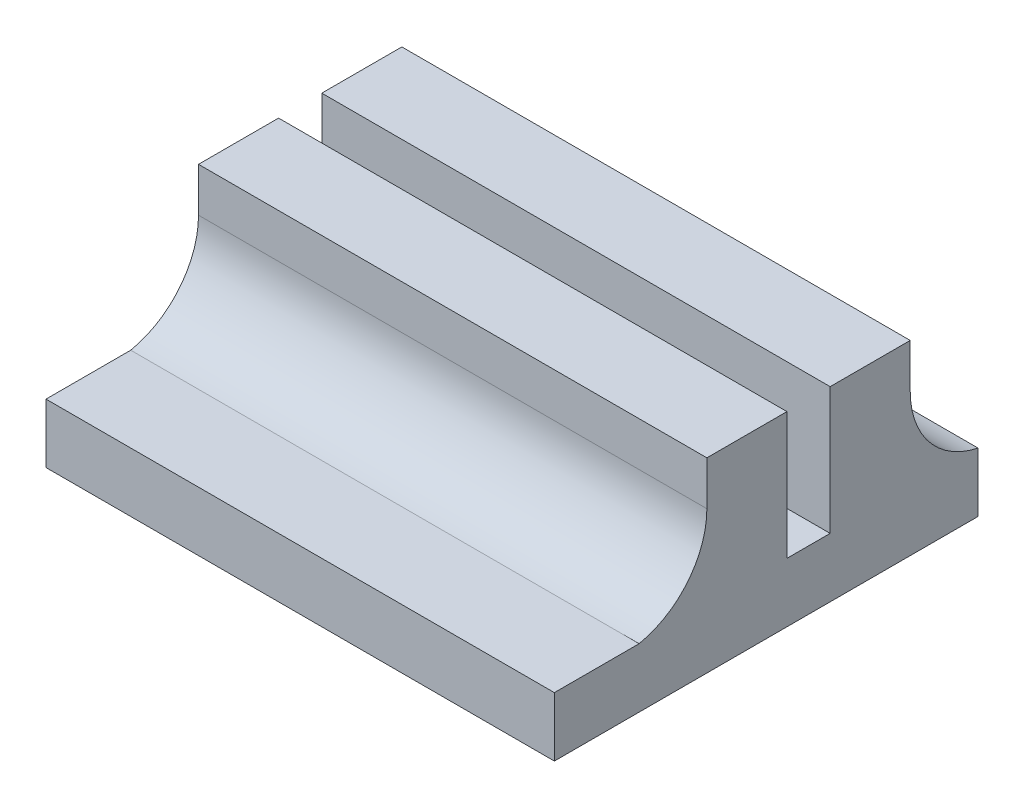
ISO-10303-21;
HEADER;
FILE_DESCRIPTION(('STEP AP214'),'2;1');
FILE_NAME('part.step','',(''),(''),'','','');
FILE_SCHEMA(('AUTOMOTIVE_DESIGN { 1 0 10303 214 1 1 1 1 }'));
ENDSEC;
DATA;
#1=APPLICATION_CONTEXT('core data for automotive mechanical design processes');
#2=APPLICATION_PROTOCOL_DEFINITION('international standard','automotive_design',2000,#1);
#3=PRODUCT_CONTEXT('',#1,'mechanical');
#4=PRODUCT('Part','Part','',(#3));
#5=PRODUCT_RELATED_PRODUCT_CATEGORY('part','',(#4));
#6=PRODUCT_DEFINITION_FORMATION('','',#4);
#7=PRODUCT_DEFINITION_CONTEXT('part definition',#1,'design');
#8=PRODUCT_DEFINITION('design','',#6,#7);
#9=PRODUCT_DEFINITION_SHAPE('','',#8);
#10=(LENGTH_UNIT() NAMED_UNIT(*) SI_UNIT(.MILLI.,.METRE.));
#11=(NAMED_UNIT(*) PLANE_ANGLE_UNIT() SI_UNIT($,.RADIAN.));
#12=(NAMED_UNIT(*) SI_UNIT($,.STERADIAN.) SOLID_ANGLE_UNIT());
#13=UNCERTAINTY_MEASURE_WITH_UNIT(LENGTH_MEASURE(1.E-05),#10,'distance_accuracy_value','');
#14=(GEOMETRIC_REPRESENTATION_CONTEXT(3) GLOBAL_UNCERTAINTY_ASSIGNED_CONTEXT((#13)) GLOBAL_UNIT_ASSIGNED_CONTEXT((#10,
#11,#12)) REPRESENTATION_CONTEXT('',''));
#15=CARTESIAN_POINT('',(0.,0.,0.));
#16=DIRECTION('',(0.,0.,1.));
#17=DIRECTION('',(1.,0.,0.));
#18=AXIS2_PLACEMENT_3D('',#15,#16,#17);
#19=CARTESIAN_POINT('',(-30.,22.,-20.));
#20=DIRECTION('',(0.,0.,1.));
#21=DIRECTION('',(1.,0.,0.));
#22=AXIS2_PLACEMENT_3D('',#19,#20,#21);
#23=PLANE('',#22);
#24=DIRECTION('',(-1.,0.,0.));
#25=VECTOR('',#24,1.);
#26=CARTESIAN_POINT('',(-30.,7.,-20.));
#27=LINE('',#26,#25);
#28=CARTESIAN_POINT('',(30.,7.,-20.));
#29=VERTEX_POINT('',#28);
#30=CARTESIAN_POINT('',(-30.,7.,-20.));
#31=VERTEX_POINT('',#30);
#32=EDGE_CURVE('E185',#29,#31,#27,.T.);
#33=ORIENTED_EDGE('',*,*,#32,.F.);
#34=DIRECTION('',(0.,-1.,0.));
#35=VECTOR('',#34,1.);
#36=CARTESIAN_POINT('',(30.,22.,-20.));
#37=LINE('',#36,#35);
#38=CARTESIAN_POINT('',(30.,0.,-20.));
#39=VERTEX_POINT('',#38);
#40=EDGE_CURVE('E259',#29,#39,#37,.T.);
#41=ORIENTED_EDGE('',*,*,#40,.T.);
#42=DIRECTION('',(-1.,0.,0.));
#43=VECTOR('',#42,1.);
#44=CARTESIAN_POINT('',(-30.,0.,-20.));
#45=LINE('',#44,#43);
#46=CARTESIAN_POINT('',(-30.,0.,-20.));
#47=VERTEX_POINT('',#46);
#48=EDGE_CURVE('E152',#39,#47,#45,.T.);
#49=ORIENTED_EDGE('',*,*,#48,.T.);
#50=DIRECTION('',(0.,-1.,0.));
#51=VECTOR('',#50,1.);
#52=CARTESIAN_POINT('',(-30.,22.,-20.));
#53=LINE('',#52,#51);
#54=EDGE_CURVE('E146',#31,#47,#53,.T.);
#55=ORIENTED_EDGE('',*,*,#54,.F.);
#56=EDGE_LOOP('',(#33,#41,#49,#55));
#57=FACE_BOUND('',#56,.T.);
#58=ADVANCED_FACE('F45',(#57),#23,.F.);
#59=CARTESIAN_POINT('',(0.,22.,0.));
#60=DIRECTION('',(0.,1.,0.));
#61=DIRECTION('',(0.,0.,1.));
#62=AXIS2_PLACEMENT_3D('',#59,#60,#61);
#63=PLANE('',#62);
#64=DIRECTION('',(-1.,0.,0.));
#65=VECTOR('',#64,1.);
#66=CARTESIAN_POINT('',(30.,22.,12.));
#67=LINE('',#66,#65);
#68=CARTESIAN_POINT('',(30.,22.,12.));
#69=VERTEX_POINT('',#68);
#70=CARTESIAN_POINT('',(-30.,22.,12.));
#71=VERTEX_POINT('',#70);
#72=EDGE_CURVE('E189',#69,#71,#67,.T.);
#73=ORIENTED_EDGE('',*,*,#72,.F.);
#74=DIRECTION('',(0.,0.,-1.));
#75=VECTOR('',#74,1.);
#76=CARTESIAN_POINT('',(30.,22.,-20.));
#77=LINE('',#76,#75);
#78=CARTESIAN_POINT('',(30.,22.,2.55));
#79=VERTEX_POINT('',#78);
#80=EDGE_CURVE('E247',#69,#79,#77,.T.);
#81=ORIENTED_EDGE('',*,*,#80,.T.);
#82=DIRECTION('',(1.,0.,0.));
#83=VECTOR('',#82,1.);
#84=CARTESIAN_POINT('',(-30.,22.,2.55));
#85=LINE('',#84,#83);
#86=CARTESIAN_POINT('',(-30.,22.,2.55));
#87=VERTEX_POINT('',#86);
#88=EDGE_CURVE('E215',#87,#79,#85,.T.);
#89=ORIENTED_EDGE('',*,*,#88,.F.);
#90=DIRECTION('',(0.,0.,1.));
#91=VECTOR('',#90,1.);
#92=CARTESIAN_POINT('',(-30.,22.,-20.));
#93=LINE('',#92,#91);
#94=EDGE_CURVE('E248',#87,#71,#93,.T.);
#95=ORIENTED_EDGE('',*,*,#94,.T.);
#96=EDGE_LOOP('',(#73,#81,#89,#95));
#97=FACE_BOUND('',#96,.T.);
#98=ADVANCED_FACE('F282',(#97),#63,.T.);
#99=CARTESIAN_POINT('',(30.,22.,-20.));
#100=DIRECTION('',(-1.,0.,0.));
#101=DIRECTION('',(0.,0.,1.));
#102=AXIS2_PLACEMENT_3D('',#99,#100,#101);
#103=PLANE('',#102);
#104=ORIENTED_EDGE('',*,*,#80,.F.);
#105=DIRECTION('',(0.,1.,0.));
#106=VECTOR('',#105,1.);
#107=CARTESIAN_POINT('',(30.,7.,12.));
#108=LINE('',#107,#106);
#109=CARTESIAN_POINT('',(30.,16.7979589711327,12.));
#110=VERTEX_POINT('',#109);
#111=EDGE_CURVE('E198',#110,#69,#108,.T.);
#112=ORIENTED_EDGE('',*,*,#111,.F.);
#113=CARTESIAN_POINT('',(30.,16.7979589711327,22.));
#114=DIRECTION('',(-1.,0.,0.));
#115=DIRECTION('',(0.,0.,1.));
#116=AXIS2_PLACEMENT_3D('',#113,#114,#115);
#117=CIRCLE('',#116,10.);
#118=CARTESIAN_POINT('',(30.,7.,20.));
#119=VERTEX_POINT('',#118);
#120=EDGE_CURVE('E270',#110,#119,#117,.T.);
#121=ORIENTED_EDGE('',*,*,#120,.T.);
#122=DIRECTION('',(0.,0.,-1.));
#123=VECTOR('',#122,1.);
#124=CARTESIAN_POINT('',(30.,7.,30.));
#125=LINE('',#124,#123);
#126=CARTESIAN_POINT('',(30.,7.,30.));
#127=VERTEX_POINT('',#126);
#128=EDGE_CURVE('E178',#127,#119,#125,.T.);
#129=ORIENTED_EDGE('',*,*,#128,.F.);
#130=DIRECTION('',(0.,1.,0.));
#131=VECTOR('',#130,1.);
#132=CARTESIAN_POINT('',(30.,7.,30.));
#133=LINE('',#132,#131);
#134=CARTESIAN_POINT('',(30.,0.,30.));
#135=VERTEX_POINT('',#134);
#136=EDGE_CURVE('E162',#135,#127,#133,.T.);
#137=ORIENTED_EDGE('',*,*,#136,.F.);
#138=DIRECTION('',(0.,0.,-1.));
#139=VECTOR('',#138,1.);
#140=CARTESIAN_POINT('',(30.,0.,-20.));
#141=LINE('',#140,#139);
#142=EDGE_CURVE('E158',#135,#39,#141,.T.);
#143=ORIENTED_EDGE('',*,*,#142,.T.);
#144=ORIENTED_EDGE('',*,*,#40,.F.);
#145=CARTESIAN_POINT('',(30.,16.7979589711327,-22.));
#146=DIRECTION('',(-1.,0.,0.));
#147=DIRECTION('',(0.,0.,1.));
#148=AXIS2_PLACEMENT_3D('',#145,#146,#147);
#149=CIRCLE('',#148,10.);
#150=CARTESIAN_POINT('',(30.,16.7979589711327,-12.));
#151=VERTEX_POINT('',#150);
#152=EDGE_CURVE('E54',#29,#151,#149,.T.);
#153=ORIENTED_EDGE('',*,*,#152,.T.);
#154=DIRECTION('',(0.,1.,0.));
#155=VECTOR('',#154,1.);
#156=CARTESIAN_POINT('',(30.,7.,-12.));
#157=LINE('',#156,#155);
#158=CARTESIAN_POINT('',(30.,22.,-12.));
#159=VERTEX_POINT('',#158);
#160=EDGE_CURVE('E186',#151,#159,#157,.T.);
#161=ORIENTED_EDGE('',*,*,#160,.T.);
#162=CARTESIAN_POINT('',(30.,22.,-2.55));
#163=VERTEX_POINT('',#162);
#164=EDGE_CURVE('E151',#163,#159,#77,.T.);
#165=ORIENTED_EDGE('',*,*,#164,.F.);
#166=DIRECTION('',(0.,1.,0.));
#167=VECTOR('',#166,1.);
#168=CARTESIAN_POINT('',(30.,7.,-2.55));
#169=LINE('',#168,#167);
#170=CARTESIAN_POINT('',(30.,7.,-2.55));
#171=VERTEX_POINT('',#170);
#172=EDGE_CURVE('E226',#171,#163,#169,.T.);
#173=ORIENTED_EDGE('',*,*,#172,.F.);
#174=DIRECTION('',(0.,0.,-1.));
#175=VECTOR('',#174,1.);
#176=CARTESIAN_POINT('',(30.,7.,2.55));
#177=LINE('',#176,#175);
#178=CARTESIAN_POINT('',(30.,7.,2.55));
#179=VERTEX_POINT('',#178);
#180=EDGE_CURVE('E210',#179,#171,#177,.T.);
#181=ORIENTED_EDGE('',*,*,#180,.F.);
#182=DIRECTION('',(0.,1.,0.));
#183=VECTOR('',#182,1.);
#184=CARTESIAN_POINT('',(30.,7.,2.55));
#185=LINE('',#184,#183);
#186=EDGE_CURVE('E231',#179,#79,#185,.T.);
#187=ORIENTED_EDGE('',*,*,#186,.T.);
#188=EDGE_LOOP('',(#104,#112,#121,#129,#137,#143,#144,#153,#161,#165,#173,#181,#187));
#189=FACE_BOUND('',#188,.T.);
#190=ADVANCED_FACE('F285',(#189),#103,.F.);
#191=CARTESIAN_POINT('',(-30.,22.,-20.));
#192=DIRECTION('',(1.,0.,0.));
#193=DIRECTION('',(0.,0.,-1.));
#194=AXIS2_PLACEMENT_3D('',#191,#192,#193);
#195=PLANE('',#194);
#196=DIRECTION('',(0.,0.,1.));
#197=VECTOR('',#196,1.);
#198=CARTESIAN_POINT('',(-30.,0.,-20.));
#199=LINE('',#198,#197);
#200=CARTESIAN_POINT('',(-30.,0.,30.));
#201=VERTEX_POINT('',#200);
#202=EDGE_CURVE('E139',#47,#201,#199,.T.);
#203=ORIENTED_EDGE('',*,*,#202,.T.);
#204=DIRECTION('',(0.,-1.,0.));
#205=VECTOR('',#204,1.);
#206=CARTESIAN_POINT('',(-30.,7.,30.));
#207=LINE('',#206,#205);
#208=CARTESIAN_POINT('',(-30.,7.,30.));
#209=VERTEX_POINT('',#208);
#210=EDGE_CURVE('E144',#209,#201,#207,.T.);
#211=ORIENTED_EDGE('',*,*,#210,.F.);
#212=DIRECTION('',(0.,0.,-1.));
#213=VECTOR('',#212,1.);
#214=CARTESIAN_POINT('',(-30.,7.,30.));
#215=LINE('',#214,#213);
#216=CARTESIAN_POINT('',(-30.,7.,20.));
#217=VERTEX_POINT('',#216);
#218=EDGE_CURVE('E175',#209,#217,#215,.T.);
#219=ORIENTED_EDGE('',*,*,#218,.T.);
#220=CARTESIAN_POINT('',(-30.,16.7979589711327,22.));
#221=DIRECTION('',(1.,0.,0.));
#222=DIRECTION('',(0.,0.,-1.));
#223=AXIS2_PLACEMENT_3D('',#220,#221,#222);
#224=CIRCLE('',#223,10.);
#225=CARTESIAN_POINT('',(-30.,16.7979589711327,12.));
#226=VERTEX_POINT('',#225);
#227=EDGE_CURVE('E267',#217,#226,#224,.T.);
#228=ORIENTED_EDGE('',*,*,#227,.T.);
#229=DIRECTION('',(0.,1.,0.));
#230=VECTOR('',#229,1.);
#231=CARTESIAN_POINT('',(-30.,7.,12.));
#232=LINE('',#231,#230);
#233=EDGE_CURVE('E181',#226,#71,#232,.T.);
#234=ORIENTED_EDGE('',*,*,#233,.T.);
#235=ORIENTED_EDGE('',*,*,#94,.F.);
#236=DIRECTION('',(0.,1.,0.));
#237=VECTOR('',#236,1.);
#238=CARTESIAN_POINT('',(-30.,7.,2.55));
#239=LINE('',#238,#237);
#240=CARTESIAN_POINT('',(-30.,7.,2.55));
#241=VERTEX_POINT('',#240);
#242=EDGE_CURVE('E235',#241,#87,#239,.T.);
#243=ORIENTED_EDGE('',*,*,#242,.F.);
#244=DIRECTION('',(0.,0.,1.));
#245=VECTOR('',#244,1.);
#246=CARTESIAN_POINT('',(-30.,7.,2.55));
#247=LINE('',#246,#245);
#248=CARTESIAN_POINT('',(-30.,7.,-2.55));
#249=VERTEX_POINT('',#248);
#250=EDGE_CURVE('E219',#249,#241,#247,.T.);
#251=ORIENTED_EDGE('',*,*,#250,.F.);
#252=DIRECTION('',(0.,1.,0.));
#253=VECTOR('',#252,1.);
#254=CARTESIAN_POINT('',(-30.,7.,-2.55));
#255=LINE('',#254,#253);
#256=CARTESIAN_POINT('',(-30.,22.,-2.55));
#257=VERTEX_POINT('',#256);
#258=EDGE_CURVE('E238',#249,#257,#255,.T.);
#259=ORIENTED_EDGE('',*,*,#258,.T.);
#260=CARTESIAN_POINT('',(-30.,22.,-12.));
#261=VERTEX_POINT('',#260);
#262=EDGE_CURVE('E252',#261,#257,#93,.T.);
#263=ORIENTED_EDGE('',*,*,#262,.F.);
#264=DIRECTION('',(0.,1.,0.));
#265=VECTOR('',#264,1.);
#266=CARTESIAN_POINT('',(-30.,7.,-12.));
#267=LINE('',#266,#265);
#268=CARTESIAN_POINT('',(-30.,16.7979589711327,-12.));
#269=VERTEX_POINT('',#268);
#270=EDGE_CURVE('E182',#269,#261,#267,.T.);
#271=ORIENTED_EDGE('',*,*,#270,.F.);
#272=CARTESIAN_POINT('',(-30.,16.7979589711327,-22.));
#273=DIRECTION('',(1.,0.,0.));
#274=DIRECTION('',(0.,0.,-1.));
#275=AXIS2_PLACEMENT_3D('',#272,#273,#274);
#276=CIRCLE('',#275,10.);
#277=EDGE_CURVE('E11',#269,#31,#276,.T.);
#278=ORIENTED_EDGE('',*,*,#277,.T.);
#279=ORIENTED_EDGE('',*,*,#54,.T.);
#280=EDGE_LOOP('',(#203,#211,#219,#228,#234,#235,#243,#251,#259,#263,#271,#278,#279));
#281=FACE_BOUND('',#280,.T.);
#282=ADVANCED_FACE('F141',(#281),#195,.F.);
#283=DIRECTION('',(1.,0.,0.));
#284=VECTOR('',#283,1.);
#285=CARTESIAN_POINT('',(-30.,22.,-12.));
#286=LINE('',#285,#284);
#287=EDGE_CURVE('E190',#261,#159,#286,.T.);
#288=ORIENTED_EDGE('',*,*,#287,.F.);
#289=ORIENTED_EDGE('',*,*,#262,.T.);
#290=DIRECTION('',(-1.,0.,0.));
#291=VECTOR('',#290,1.);
#292=CARTESIAN_POINT('',(-30.,22.,-2.55));
#293=LINE('',#292,#291);
#294=EDGE_CURVE('E194',#163,#257,#293,.T.);
#295=ORIENTED_EDGE('',*,*,#294,.F.);
#296=ORIENTED_EDGE('',*,*,#164,.T.);
#297=EDGE_LOOP('',(#288,#289,#295,#296));
#298=FACE_BOUND('',#297,.T.);
#299=ADVANCED_FACE('F326',(#298),#63,.T.);
#300=CARTESIAN_POINT('',(0.,0.,0.));
#301=DIRECTION('',(0.,1.,0.));
#302=DIRECTION('',(0.,0.,1.));
#303=AXIS2_PLACEMENT_3D('',#300,#301,#302);
#304=PLANE('',#303);
#305=ORIENTED_EDGE('',*,*,#142,.F.);
#306=DIRECTION('',(1.,0.,0.));
#307=VECTOR('',#306,1.);
#308=CARTESIAN_POINT('',(-30.,0.,30.));
#309=LINE('',#308,#307);
#310=EDGE_CURVE('E155',#201,#135,#309,.T.);
#311=ORIENTED_EDGE('',*,*,#310,.F.);
#312=ORIENTED_EDGE('',*,*,#202,.F.);
#313=ORIENTED_EDGE('',*,*,#48,.F.);
#314=EDGE_LOOP('',(#305,#311,#312,#313));
#315=FACE_BOUND('',#314,.T.);
#316=ADVANCED_FACE('F156',(#315),#304,.F.);
#317=CARTESIAN_POINT('',(-30.,7.,2.55));
#318=DIRECTION('',(0.,0.,1.));
#319=DIRECTION('',(1.,0.,0.));
#320=AXIS2_PLACEMENT_3D('',#317,#318,#319);
#321=PLANE('',#320);
#322=ORIENTED_EDGE('',*,*,#88,.T.);
#323=ORIENTED_EDGE('',*,*,#186,.F.);
#324=DIRECTION('',(1.,0.,0.));
#325=VECTOR('',#324,1.);
#326=CARTESIAN_POINT('',(-30.,7.,2.55));
#327=LINE('',#326,#325);
#328=EDGE_CURVE('E222',#241,#179,#327,.T.);
#329=ORIENTED_EDGE('',*,*,#328,.F.);
#330=ORIENTED_EDGE('',*,*,#242,.T.);
#331=EDGE_LOOP('',(#322,#323,#329,#330));
#332=FACE_BOUND('',#331,.T.);
#333=ADVANCED_FACE('F291',(#332),#321,.F.);
#334=CARTESIAN_POINT('',(-30.,7.,-2.55));
#335=DIRECTION('',(0.,0.,-1.));
#336=DIRECTION('',(-1.,0.,0.));
#337=AXIS2_PLACEMENT_3D('',#334,#335,#336);
#338=PLANE('',#337);
#339=ORIENTED_EDGE('',*,*,#294,.T.);
#340=ORIENTED_EDGE('',*,*,#258,.F.);
#341=DIRECTION('',(-1.,0.,0.));
#342=VECTOR('',#341,1.);
#343=CARTESIAN_POINT('',(-30.,7.,-2.55));
#344=LINE('',#343,#342);
#345=EDGE_CURVE('E214',#171,#249,#344,.T.);
#346=ORIENTED_EDGE('',*,*,#345,.F.);
#347=ORIENTED_EDGE('',*,*,#172,.T.);
#348=EDGE_LOOP('',(#339,#340,#346,#347));
#349=FACE_BOUND('',#348,.T.);
#350=ADVANCED_FACE('F342',(#349),#338,.F.);
#351=CARTESIAN_POINT('',(0.,7.,0.));
#352=DIRECTION('',(0.,-1.,0.));
#353=DIRECTION('',(0.,0.,-1.));
#354=AXIS2_PLACEMENT_3D('',#351,#352,#353);
#355=PLANE('',#354);
#356=ORIENTED_EDGE('',*,*,#180,.T.);
#357=ORIENTED_EDGE('',*,*,#345,.T.);
#358=ORIENTED_EDGE('',*,*,#250,.T.);
#359=ORIENTED_EDGE('',*,*,#328,.T.);
#360=EDGE_LOOP('',(#356,#357,#358,#359));
#361=FACE_BOUND('',#360,.T.);
#362=ADVANCED_FACE('F294',(#361),#355,.F.);
#363=CARTESIAN_POINT('',(-30.,7.,-12.));
#364=DIRECTION('',(0.,0.,1.));
#365=DIRECTION('',(1.,0.,0.));
#366=AXIS2_PLACEMENT_3D('',#363,#364,#365);
#367=PLANE('',#366);
#368=ORIENTED_EDGE('',*,*,#160,.F.);
#369=DIRECTION('',(1.,0.,0.));
#370=VECTOR('',#369,1.);
#371=CARTESIAN_POINT('',(-30.,16.7979589711327,-12.));
#372=LINE('',#371,#370);
#373=EDGE_CURVE('E61',#151,#269,#372,.F.);
#374=ORIENTED_EDGE('',*,*,#373,.T.);
#375=ORIENTED_EDGE('',*,*,#270,.T.);
#376=ORIENTED_EDGE('',*,*,#287,.T.);
#377=EDGE_LOOP('',(#368,#374,#375,#376));
#378=FACE_BOUND('',#377,.T.);
#379=ADVANCED_FACE('F336',(#378),#367,.F.);
#380=CARTESIAN_POINT('',(30.,7.,12.));
#381=DIRECTION('',(0.,0.,-1.));
#382=DIRECTION('',(-1.,0.,0.));
#383=AXIS2_PLACEMENT_3D('',#380,#381,#382);
#384=PLANE('',#383);
#385=ORIENTED_EDGE('',*,*,#233,.F.);
#386=DIRECTION('',(-1.,0.,0.));
#387=VECTOR('',#386,1.);
#388=CARTESIAN_POINT('',(30.,16.7979589711327,12.));
#389=LINE('',#388,#387);
#390=EDGE_CURVE('E262',#226,#110,#389,.F.);
#391=ORIENTED_EDGE('',*,*,#390,.T.);
#392=ORIENTED_EDGE('',*,*,#111,.T.);
#393=ORIENTED_EDGE('',*,*,#72,.T.);
#394=EDGE_LOOP('',(#385,#391,#392,#393));
#395=FACE_BOUND('',#394,.T.);
#396=ADVANCED_FACE('F301',(#395),#384,.F.);
#397=CARTESIAN_POINT('',(0.,16.7979589711327,22.));
#398=DIRECTION('',(-1.,0.,0.));
#399=DIRECTION('',(0.,0.,1.));
#400=AXIS2_PLACEMENT_3D('',#397,#398,#399);
#401=CYLINDRICAL_SURFACE('',#400,10.);
#402=ORIENTED_EDGE('',*,*,#120,.F.);
#403=ORIENTED_EDGE('',*,*,#390,.F.);
#404=ORIENTED_EDGE('',*,*,#227,.F.);
#405=DIRECTION('',(1.,0.,0.));
#406=VECTOR('',#405,1.);
#407=CARTESIAN_POINT('',(30.,7.,20.));
#408=LINE('',#407,#406);
#409=EDGE_CURVE('E201',#217,#119,#408,.T.);
#410=ORIENTED_EDGE('',*,*,#409,.T.);
#411=EDGE_LOOP('',(#402,#403,#404,#410));
#412=FACE_BOUND('',#411,.T.);
#413=ADVANCED_FACE('F303',(#412),#401,.F.);
#414=CARTESIAN_POINT('',(0.,16.7979589711327,-22.));
#415=DIRECTION('',(1.,0.,0.));
#416=DIRECTION('',(0.,0.,-1.));
#417=AXIS2_PLACEMENT_3D('',#414,#415,#416);
#418=CYLINDRICAL_SURFACE('',#417,10.);
#419=ORIENTED_EDGE('',*,*,#277,.F.);
#420=ORIENTED_EDGE('',*,*,#373,.F.);
#421=ORIENTED_EDGE('',*,*,#152,.F.);
#422=ORIENTED_EDGE('',*,*,#32,.T.);
#423=EDGE_LOOP('',(#419,#420,#421,#422));
#424=FACE_BOUND('',#423,.T.);
#425=ADVANCED_FACE('F47',(#424),#418,.F.);
#426=CARTESIAN_POINT('',(-30.,7.,30.));
#427=DIRECTION('',(0.,-1.,0.));
#428=DIRECTION('',(0.,0.,-1.));
#429=AXIS2_PLACEMENT_3D('',#426,#427,#428);
#430=PLANE('',#429);
#431=ORIENTED_EDGE('',*,*,#409,.F.);
#432=ORIENTED_EDGE('',*,*,#218,.F.);
#433=DIRECTION('',(-1.,0.,0.));
#434=VECTOR('',#433,1.);
#435=CARTESIAN_POINT('',(-30.,7.,30.));
#436=LINE('',#435,#434);
#437=EDGE_CURVE('E166',#127,#209,#436,.T.);
#438=ORIENTED_EDGE('',*,*,#437,.F.);
#439=ORIENTED_EDGE('',*,*,#128,.T.);
#440=EDGE_LOOP('',(#431,#432,#438,#439));
#441=FACE_BOUND('',#440,.T.);
#442=ADVANCED_FACE('F306',(#441),#430,.F.);
#443=CARTESIAN_POINT('',(0.,0.,30.));
#444=DIRECTION('',(0.,0.,1.));
#445=DIRECTION('',(1.,0.,0.));
#446=AXIS2_PLACEMENT_3D('',#443,#444,#445);
#447=PLANE('',#446);
#448=ORIENTED_EDGE('',*,*,#210,.T.);
#449=ORIENTED_EDGE('',*,*,#310,.T.);
#450=ORIENTED_EDGE('',*,*,#136,.T.);
#451=ORIENTED_EDGE('',*,*,#437,.T.);
#452=EDGE_LOOP('',(#448,#449,#450,#451));
#453=FACE_BOUND('',#452,.T.);
#454=ADVANCED_FACE('F164',(#453),#447,.T.);
#455=CLOSED_SHELL('',(#58,#98,#190,#282,#299,#316,#333,#350,#362,#379,#396,#413,#425,#442,#454));
#456=MANIFOLD_SOLID_BREP('B2',#455);
#457=ADVANCED_BREP_SHAPE_REPRESENTATION('',(#18,#456),#14);
#458=SHAPE_DEFINITION_REPRESENTATION(#9,#457);
ENDSEC;
END-ISO-10303-21;
